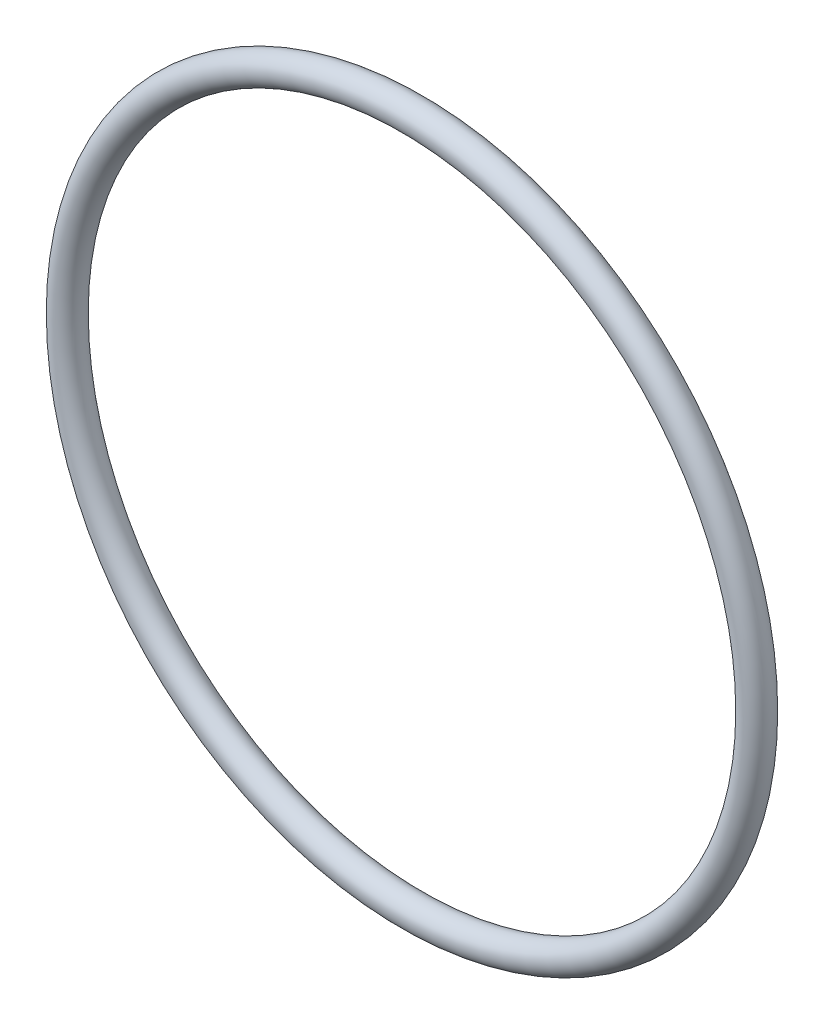
ISO-10303-21;
HEADER;
FILE_DESCRIPTION(('STEP AP214'),'2;1');
FILE_NAME('part.step','',(''),(''),'','','');
FILE_SCHEMA(('AUTOMOTIVE_DESIGN { 1 0 10303 214 1 1 1 1 }'));
ENDSEC;
DATA;
#1=APPLICATION_CONTEXT('core data for automotive mechanical design processes');
#2=APPLICATION_PROTOCOL_DEFINITION('international standard','automotive_design',2000,#1);
#3=PRODUCT_CONTEXT('',#1,'mechanical');
#4=PRODUCT('Part','Part','',(#3));
#5=PRODUCT_RELATED_PRODUCT_CATEGORY('part','',(#4));
#6=PRODUCT_DEFINITION_FORMATION('','',#4);
#7=PRODUCT_DEFINITION_CONTEXT('part definition',#1,'design');
#8=PRODUCT_DEFINITION('design','',#6,#7);
#9=PRODUCT_DEFINITION_SHAPE('','',#8);
#10=(LENGTH_UNIT() NAMED_UNIT(*) SI_UNIT(.MILLI.,.METRE.));
#11=(NAMED_UNIT(*) PLANE_ANGLE_UNIT() SI_UNIT($,.RADIAN.));
#12=(NAMED_UNIT(*) SI_UNIT($,.STERADIAN.) SOLID_ANGLE_UNIT());
#13=UNCERTAINTY_MEASURE_WITH_UNIT(LENGTH_MEASURE(1.E-05),#10,'distance_accuracy_value','');
#14=(GEOMETRIC_REPRESENTATION_CONTEXT(3) GLOBAL_UNCERTAINTY_ASSIGNED_CONTEXT((#13)) GLOBAL_UNIT_ASSIGNED_CONTEXT((#10,
#11,#12)) REPRESENTATION_CONTEXT('',''));
#15=CARTESIAN_POINT('',(0.,0.,0.));
#16=DIRECTION('',(0.,0.,1.));
#17=DIRECTION('',(1.,0.,0.));
#18=AXIS2_PLACEMENT_3D('',#15,#16,#17);
#19=CARTESIAN_POINT('',(0.,0.,0.));
#20=DIRECTION('',(0.,0.,-1.));
#21=DIRECTION('',(-1.,0.,0.));
#22=AXIS2_PLACEMENT_3D('',#19,#20,#21);
#23=TOROIDAL_SURFACE('',#22,20.9,0.9);
#24=CARTESIAN_POINT('',(-21.8,0.,0.));
#25=VERTEX_POINT('',#24);
#26=VERTEX_LOOP('',#25);
#27=FACE_BOUND('',#26,.T.);
#28=ADVANCED_FACE('F30',(#27),#23,.T.);
#29=CLOSED_SHELL('',(#28));
#30=MANIFOLD_SOLID_BREP('B2',#29);
#31=ADVANCED_BREP_SHAPE_REPRESENTATION('',(#18,#30),#14);
#32=SHAPE_DEFINITION_REPRESENTATION(#9,#31);
ENDSEC;
END-ISO-10303-21;
